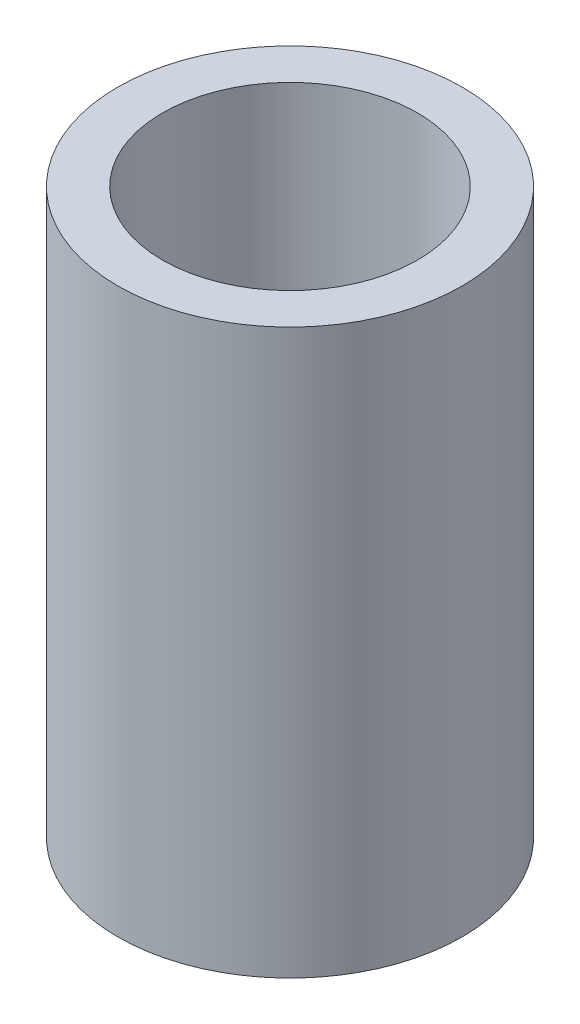
ISO-10303-21;
HEADER;
FILE_DESCRIPTION(('STEP AP214'),'2;1');
FILE_NAME('part.step','',(''),(''),'','','');
FILE_SCHEMA(('AUTOMOTIVE_DESIGN { 1 0 10303 214 1 1 1 1 }'));
ENDSEC;
DATA;
#1=APPLICATION_CONTEXT('core data for automotive mechanical design processes');
#2=APPLICATION_PROTOCOL_DEFINITION('international standard','automotive_design',2000,#1);
#3=PRODUCT_CONTEXT('',#1,'mechanical');
#4=PRODUCT('Part','Part','',(#3));
#5=PRODUCT_RELATED_PRODUCT_CATEGORY('part','',(#4));
#6=PRODUCT_DEFINITION_FORMATION('','',#4);
#7=PRODUCT_DEFINITION_CONTEXT('part definition',#1,'design');
#8=PRODUCT_DEFINITION('design','',#6,#7);
#9=PRODUCT_DEFINITION_SHAPE('','',#8);
#10=(LENGTH_UNIT() NAMED_UNIT(*) SI_UNIT(.MILLI.,.METRE.));
#11=(NAMED_UNIT(*) PLANE_ANGLE_UNIT() SI_UNIT($,.RADIAN.));
#12=(NAMED_UNIT(*) SI_UNIT($,.STERADIAN.) SOLID_ANGLE_UNIT());
#13=UNCERTAINTY_MEASURE_WITH_UNIT(LENGTH_MEASURE(1.E-05),#10,'distance_accuracy_value','');
#14=(GEOMETRIC_REPRESENTATION_CONTEXT(3) GLOBAL_UNCERTAINTY_ASSIGNED_CONTEXT((#13)) GLOBAL_UNIT_ASSIGNED_CONTEXT((#10,
#11,#12)) REPRESENTATION_CONTEXT('',''));
#15=CARTESIAN_POINT('',(0.,0.,0.));
#16=DIRECTION('',(0.,0.,1.));
#17=DIRECTION('',(1.,0.,0.));
#18=AXIS2_PLACEMENT_3D('',#15,#16,#17);
#19=CARTESIAN_POINT('',(0.,34.925,0.));
#20=DIRECTION('',(0.,1.,0.));
#21=DIRECTION('',(0.,0.,1.));
#22=AXIS2_PLACEMENT_3D('',#19,#20,#21);
#23=PLANE('',#22);
#24=CARTESIAN_POINT('',(0.,34.925,0.));
#25=DIRECTION('',(0.,1.,0.));
#26=DIRECTION('',(0.,0.,1.));
#27=AXIS2_PLACEMENT_3D('',#24,#25,#26);
#28=CIRCLE('',#27,10.668);
#29=CARTESIAN_POINT('',(0.,34.925,10.668));
#30=VERTEX_POINT('',#29);
#31=EDGE_CURVE('E10',#30,#30,#28,.T.);
#32=ORIENTED_EDGE('',*,*,#31,.T.);
#33=EDGE_LOOP('',(#32));
#34=FACE_BOUND('',#33,.T.);
#35=CARTESIAN_POINT('',(0.,34.925,0.));
#36=DIRECTION('',(0.,1.,0.));
#37=DIRECTION('',(0.,0.,1.));
#38=AXIS2_PLACEMENT_3D('',#35,#36,#37);
#39=CIRCLE('',#38,7.8994);
#40=CARTESIAN_POINT('',(0.,34.925,7.8994));
#41=VERTEX_POINT('',#40);
#42=EDGE_CURVE('E50',#41,#41,#39,.T.);
#43=ORIENTED_EDGE('',*,*,#42,.F.);
#44=EDGE_LOOP('',(#43));
#45=FACE_BOUND('',#44,.T.);
#46=ADVANCED_FACE('F37',(#34,#45),#23,.T.);
#47=CARTESIAN_POINT('',(0.,0.,0.));
#48=DIRECTION('',(0.,1.,0.));
#49=DIRECTION('',(0.,0.,1.));
#50=AXIS2_PLACEMENT_3D('',#47,#48,#49);
#51=PLANE('',#50);
#52=CARTESIAN_POINT('',(0.,0.,0.));
#53=DIRECTION('',(0.,1.,0.));
#54=DIRECTION('',(0.,0.,1.));
#55=AXIS2_PLACEMENT_3D('',#52,#53,#54);
#56=CIRCLE('',#55,10.668);
#57=CARTESIAN_POINT('',(0.,0.,10.668));
#58=VERTEX_POINT('',#57);
#59=EDGE_CURVE('E41',#58,#58,#56,.T.);
#60=ORIENTED_EDGE('',*,*,#59,.F.);
#61=EDGE_LOOP('',(#60));
#62=FACE_BOUND('',#61,.T.);
#63=CARTESIAN_POINT('',(0.,0.,0.));
#64=DIRECTION('',(0.,1.,0.));
#65=DIRECTION('',(0.,0.,1.));
#66=AXIS2_PLACEMENT_3D('',#63,#64,#65);
#67=CIRCLE('',#66,7.8994);
#68=CARTESIAN_POINT('',(0.,0.,7.8994));
#69=VERTEX_POINT('',#68);
#70=EDGE_CURVE('E52',#69,#69,#67,.T.);
#71=ORIENTED_EDGE('',*,*,#70,.T.);
#72=EDGE_LOOP('',(#71));
#73=FACE_BOUND('',#72,.T.);
#74=ADVANCED_FACE('F64',(#62,#73),#51,.F.);
#75=CARTESIAN_POINT('',(0.,34.925,0.));
#76=DIRECTION('',(0.,-1.,0.));
#77=DIRECTION('',(0.,0.,-1.));
#78=AXIS2_PLACEMENT_3D('',#75,#76,#77);
#79=CYLINDRICAL_SURFACE('',#78,10.668);
#80=ORIENTED_EDGE('',*,*,#31,.F.);
#81=EDGE_LOOP('',(#80));
#82=FACE_BOUND('',#81,.T.);
#83=ORIENTED_EDGE('',*,*,#59,.T.);
#84=EDGE_LOOP('',(#83));
#85=FACE_BOUND('',#84,.T.);
#86=ADVANCED_FACE('F39',(#82,#85),#79,.T.);
#87=CARTESIAN_POINT('',(0.,34.925,0.));
#88=DIRECTION('',(0.,-1.,0.));
#89=DIRECTION('',(0.,0.,-1.));
#90=AXIS2_PLACEMENT_3D('',#87,#88,#89);
#91=CYLINDRICAL_SURFACE('',#90,7.8994);
#92=ORIENTED_EDGE('',*,*,#42,.T.);
#93=EDGE_LOOP('',(#92));
#94=FACE_BOUND('',#93,.T.);
#95=ORIENTED_EDGE('',*,*,#70,.F.);
#96=EDGE_LOOP('',(#95));
#97=FACE_BOUND('',#96,.T.);
#98=ADVANCED_FACE('F60',(#94,#97),#91,.F.);
#99=CLOSED_SHELL('',(#46,#74,#86,#98));
#100=MANIFOLD_SOLID_BREP('B2',#99);
#101=ADVANCED_BREP_SHAPE_REPRESENTATION('',(#18,#100),#14);
#102=SHAPE_DEFINITION_REPRESENTATION(#9,#101);
ENDSEC;
END-ISO-10303-21;
